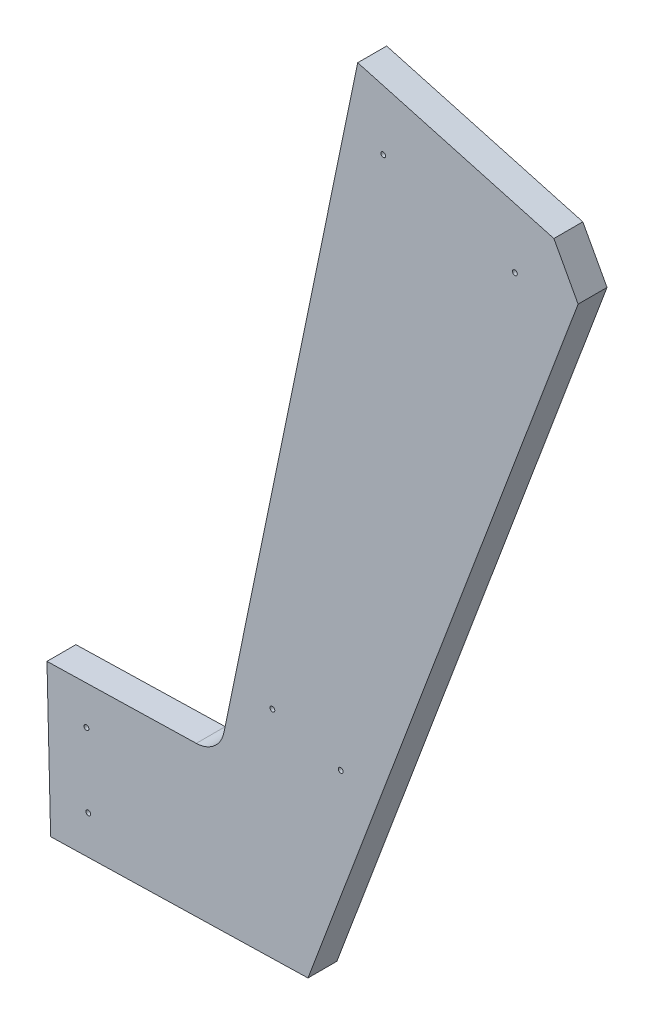
ISO-10303-21;
HEADER;
FILE_DESCRIPTION(('STEP AP214'),'2;1');
FILE_NAME('part.step','',(''),(''),'','','');
FILE_SCHEMA(('AUTOMOTIVE_DESIGN { 1 0 10303 214 1 1 1 1 }'));
ENDSEC;
DATA;
#1=APPLICATION_CONTEXT('core data for automotive mechanical design processes');
#2=APPLICATION_PROTOCOL_DEFINITION('international standard','automotive_design',2000,#1);
#3=PRODUCT_CONTEXT('',#1,'mechanical');
#4=PRODUCT('Part','Part','',(#3));
#5=PRODUCT_RELATED_PRODUCT_CATEGORY('part','',(#4));
#6=PRODUCT_DEFINITION_FORMATION('','',#4);
#7=PRODUCT_DEFINITION_CONTEXT('part definition',#1,'design');
#8=PRODUCT_DEFINITION('design','',#6,#7);
#9=PRODUCT_DEFINITION_SHAPE('','',#8);
#10=(LENGTH_UNIT() NAMED_UNIT(*) SI_UNIT(.MILLI.,.METRE.));
#11=(NAMED_UNIT(*) PLANE_ANGLE_UNIT() SI_UNIT($,.RADIAN.));
#12=(NAMED_UNIT(*) SI_UNIT($,.STERADIAN.) SOLID_ANGLE_UNIT());
#13=UNCERTAINTY_MEASURE_WITH_UNIT(LENGTH_MEASURE(1.E-05),#10,'distance_accuracy_value','');
#14=(GEOMETRIC_REPRESENTATION_CONTEXT(3) GLOBAL_UNCERTAINTY_ASSIGNED_CONTEXT((#13)) GLOBAL_UNIT_ASSIGNED_CONTEXT((#10,
#11,#12)) REPRESENTATION_CONTEXT('',''));
#15=CARTESIAN_POINT('',(0.,0.,0.));
#16=DIRECTION('',(0.,0.,1.));
#17=DIRECTION('',(1.,0.,0.));
#18=AXIS2_PLACEMENT_3D('',#15,#16,#17);
#19=CARTESIAN_POINT('',(142.933900932431,-61.3062237529481,19.05));
#20=DIRECTION('',(0.979276102976253,-0.202529785808515,0.));
#21=DIRECTION('',(0.202529785808515,0.979276102976253,0.));
#22=AXIS2_PLACEMENT_3D('',#19,#20,#21);
#23=PLANE('',#22);
#24=DIRECTION('',(-0.202529785808515,-0.979276102976253,0.));
#25=VECTOR('',#24,1.);
#26=CARTESIAN_POINT('',(142.933900932431,-61.3062237529481,0.));
#27=LINE('',#26,#25);
#28=CARTESIAN_POINT('',(142.933900932431,-61.3062237529481,0.));
#29=VERTEX_POINT('',#28);
#30=CARTESIAN_POINT('',(54.780700043986,-487.546357698174,0.));
#31=VERTEX_POINT('',#30);
#32=EDGE_CURVE('E131',#29,#31,#27,.T.);
#33=ORIENTED_EDGE('',*,*,#32,.T.);
#34=DIRECTION('',(0.,0.,-1.));
#35=VECTOR('',#34,1.);
#36=CARTESIAN_POINT('',(54.780700043986,-487.546357698174,19.05));
#37=LINE('',#36,#35);
#38=CARTESIAN_POINT('',(54.780700043986,-487.546357698174,19.05));
#39=VERTEX_POINT('',#38);
#40=EDGE_CURVE('E11',#39,#31,#37,.T.);
#41=ORIENTED_EDGE('',*,*,#40,.F.);
#42=DIRECTION('',(-0.202529785808515,-0.979276102976253,0.));
#43=VECTOR('',#42,1.);
#44=CARTESIAN_POINT('',(142.933900932431,-61.3062237529481,19.05));
#45=LINE('',#44,#43);
#46=CARTESIAN_POINT('',(142.933900932431,-61.3062237529481,19.05));
#47=VERTEX_POINT('',#46);
#48=EDGE_CURVE('E146',#47,#39,#45,.T.);
#49=ORIENTED_EDGE('',*,*,#48,.F.);
#50=DIRECTION('',(0.,0.,-1.));
#51=VECTOR('',#50,1.);
#52=CARTESIAN_POINT('',(142.933900932431,-61.3062237529481,19.05));
#53=LINE('',#52,#51);
#54=EDGE_CURVE('E127',#47,#29,#53,.T.);
#55=ORIENTED_EDGE('',*,*,#54,.T.);
#56=EDGE_LOOP('',(#33,#41,#49,#55));
#57=FACE_BOUND('',#56,.T.);
#58=ADVANCED_FACE('F33',(#57),#23,.F.);
#59=CARTESIAN_POINT('',(36.1254902822884,-483.688165278521,19.05));
#60=DIRECTION('',(0.,0.,-1.));
#61=DIRECTION('',(-1.,0.,0.));
#62=AXIS2_PLACEMENT_3D('',#59,#60,#61);
#63=CYLINDRICAL_SURFACE('',#62,19.05);
#64=CARTESIAN_POINT('',(36.1254902822884,-483.688165278521,0.));
#65=DIRECTION('',(0.,0.,-1.));
#66=DIRECTION('',(-1.,0.,0.));
#67=AXIS2_PLACEMENT_3D('',#64,#65,#66);
#68=CIRCLE('',#67,19.05);
#69=CARTESIAN_POINT('',(36.5904963039966,-502.732489089037,0.));
#70=VERTEX_POINT('',#69);
#71=EDGE_CURVE('E134',#31,#70,#68,.T.);
#72=ORIENTED_EDGE('',*,*,#71,.T.);
#73=DIRECTION('',(0.,0.,-1.));
#74=VECTOR('',#73,1.);
#75=CARTESIAN_POINT('',(36.5904963039966,-502.732489089037,19.05));
#76=LINE('',#75,#74);
#77=CARTESIAN_POINT('',(36.5904963039966,-502.732489089037,19.05));
#78=VERTEX_POINT('',#77);
#79=EDGE_CURVE('E42',#78,#70,#76,.T.);
#80=ORIENTED_EDGE('',*,*,#79,.F.);
#81=CARTESIAN_POINT('',(36.1254902822884,-483.688165278521,19.05));
#82=DIRECTION('',(0.,0.,-1.));
#83=DIRECTION('',(-1.,0.,0.));
#84=AXIS2_PLACEMENT_3D('',#81,#82,#83);
#85=CIRCLE('',#84,19.05);
#86=EDGE_CURVE('E94',#39,#78,#85,.T.);
#87=ORIENTED_EDGE('',*,*,#86,.F.);
#88=ORIENTED_EDGE('',*,*,#40,.T.);
#89=EDGE_LOOP('',(#72,#80,#87,#88));
#90=FACE_BOUND('',#89,.T.);
#91=ADVANCED_FACE('F223',(#90),#63,.F.);
#92=CARTESIAN_POINT('',(36.5904963039966,-502.732489089037,19.05));
#93=DIRECTION('',(0.0244097649190735,-0.999702037297412,0.));
#94=DIRECTION('',(0.999702037297412,0.0244097649190735,0.));
#95=AXIS2_PLACEMENT_3D('',#92,#93,#94);
#96=PLANE('',#95);
#97=DIRECTION('',(-0.999702037297412,-0.0244097649190735,0.));
#98=VECTOR('',#97,1.);
#99=CARTESIAN_POINT('',(36.5904963039966,-502.732489089037,0.));
#100=LINE('',#99,#98);
#101=CARTESIAN_POINT('',(-61.753066591888,-505.133747826173,0.));
#102=VERTEX_POINT('',#101);
#103=EDGE_CURVE('E137',#70,#102,#100,.T.);
#104=ORIENTED_EDGE('',*,*,#103,.T.);
#105=DIRECTION('',(0.,0.,-1.));
#106=VECTOR('',#105,1.);
#107=CARTESIAN_POINT('',(-61.753066591888,-505.133747826173,19.05));
#108=LINE('',#107,#106);
#109=CARTESIAN_POINT('',(-61.753066591888,-505.133747826173,19.05));
#110=VERTEX_POINT('',#109);
#111=EDGE_CURVE('E153',#110,#102,#108,.T.);
#112=ORIENTED_EDGE('',*,*,#111,.F.);
#113=DIRECTION('',(-0.999702037297412,-0.0244097649190735,0.));
#114=VECTOR('',#113,1.);
#115=CARTESIAN_POINT('',(36.5904963039966,-502.732489089037,19.05));
#116=LINE('',#115,#114);
#117=EDGE_CURVE('E191',#78,#110,#116,.T.);
#118=ORIENTED_EDGE('',*,*,#117,.F.);
#119=ORIENTED_EDGE('',*,*,#79,.T.);
#120=EDGE_LOOP('',(#104,#112,#118,#119));
#121=FACE_BOUND('',#120,.T.);
#122=ADVANCED_FACE('F227',(#121),#96,.F.);
#123=CARTESIAN_POINT('',(-61.753066591888,-505.133747826173,19.05));
#124=DIRECTION('',(0.999702037297413,0.0244097649190363,0.));
#125=DIRECTION('',(-0.0244097649190363,0.999702037297413,0.));
#126=AXIS2_PLACEMENT_3D('',#123,#124,#125);
#127=PLANE('',#126);
#128=DIRECTION('',(0.0244097649190363,-0.999702037297413,0.));
#129=VECTOR('',#128,1.);
#130=CARTESIAN_POINT('',(-61.753066591888,-505.133747826173,0.));
#131=LINE('',#130,#129);
#132=CARTESIAN_POINT('',(-59.3403163112281,-603.947946941402,0.));
#133=VERTEX_POINT('',#132);
#134=EDGE_CURVE('E139',#102,#133,#131,.T.);
#135=ORIENTED_EDGE('',*,*,#134,.T.);
#136=DIRECTION('',(0.,0.,-1.));
#137=VECTOR('',#136,1.);
#138=CARTESIAN_POINT('',(-59.3403163112281,-603.947946941402,19.05));
#139=LINE('',#138,#137);
#140=CARTESIAN_POINT('',(-59.3403163112281,-603.947946941402,19.05));
#141=VERTEX_POINT('',#140);
#142=EDGE_CURVE('E150',#141,#133,#139,.T.);
#143=ORIENTED_EDGE('',*,*,#142,.F.);
#144=DIRECTION('',(0.0244097649190363,-0.999702037297413,0.));
#145=VECTOR('',#144,1.);
#146=CARTESIAN_POINT('',(-61.753066591888,-505.133747826173,19.05));
#147=LINE('',#146,#145);
#148=EDGE_CURVE('E193',#110,#141,#147,.T.);
#149=ORIENTED_EDGE('',*,*,#148,.F.);
#150=ORIENTED_EDGE('',*,*,#111,.T.);
#151=EDGE_LOOP('',(#135,#143,#149,#150));
#152=FACE_BOUND('',#151,.T.);
#153=ADVANCED_FACE('F199',(#152),#127,.F.);
#154=CARTESIAN_POINT('',(-59.3403163112281,-603.947946941402,19.05));
#155=DIRECTION('',(-0.0244097649190362,0.999702037297413,0.));
#156=DIRECTION('',(-0.999702037297413,-0.0244097649190362,0.));
#157=AXIS2_PLACEMENT_3D('',#154,#155,#156);
#158=PLANE('',#157);
#159=DIRECTION('',(0.999702037297413,0.0244097649190362,0.));
#160=VECTOR('',#159,1.);
#161=CARTESIAN_POINT('',(-59.3403163112281,-603.947946941402,0.));
#162=LINE('',#161,#160);
#163=CARTESIAN_POINT('',(110.157739028049,-599.809306095725,0.));
#164=VERTEX_POINT('',#163);
#165=EDGE_CURVE('E141',#133,#164,#162,.T.);
#166=ORIENTED_EDGE('',*,*,#165,.T.);
#167=DIRECTION('',(0.,0.,-1.));
#168=VECTOR('',#167,1.);
#169=CARTESIAN_POINT('',(110.157739028049,-599.809306095725,19.05));
#170=LINE('',#169,#168);
#171=CARTESIAN_POINT('',(110.157739028049,-599.809306095725,19.05));
#172=VERTEX_POINT('',#171);
#173=EDGE_CURVE('E122',#172,#164,#170,.T.);
#174=ORIENTED_EDGE('',*,*,#173,.F.);
#175=DIRECTION('',(0.999702037297413,0.0244097649190362,0.));
#176=VECTOR('',#175,1.);
#177=CARTESIAN_POINT('',(-59.3403163112281,-603.947946941402,19.05));
#178=LINE('',#177,#176);
#179=EDGE_CURVE('E113',#141,#172,#178,.T.);
#180=ORIENTED_EDGE('',*,*,#179,.F.);
#181=ORIENTED_EDGE('',*,*,#142,.T.);
#182=EDGE_LOOP('',(#166,#174,#180,#181));
#183=FACE_BOUND('',#182,.T.);
#184=ADVANCED_FACE('F203',(#183),#158,.F.);
#185=CARTESIAN_POINT('',(110.157739028049,-599.809306095725,19.05));
#186=DIRECTION('',(-0.936051647242134,0.35186263469611,0.));
#187=DIRECTION('',(-0.35186263469611,-0.936051647242134,0.));
#188=AXIS2_PLACEMENT_3D('',#185,#186,#187);
#189=PLANE('',#188);
#190=DIRECTION('',(0.35186263469611,0.936051647242134,0.));
#191=VECTOR('',#190,1.);
#192=CARTESIAN_POINT('',(110.157739028049,-599.809306095725,0.));
#193=LINE('',#192,#191);
#194=CARTESIAN_POINT('',(288.094390134916,-126.44874163232,0.));
#195=VERTEX_POINT('',#194);
#196=EDGE_CURVE('E121',#164,#195,#193,.T.);
#197=ORIENTED_EDGE('',*,*,#196,.T.);
#198=DIRECTION('',(0.,0.,-1.));
#199=VECTOR('',#198,1.);
#200=CARTESIAN_POINT('',(288.094390134916,-126.44874163232,19.05));
#201=LINE('',#200,#199);
#202=CARTESIAN_POINT('',(288.094390134916,-126.44874163232,19.05));
#203=VERTEX_POINT('',#202);
#204=EDGE_CURVE('E118',#203,#195,#201,.T.);
#205=ORIENTED_EDGE('',*,*,#204,.F.);
#206=DIRECTION('',(0.35186263469611,0.936051647242134,0.));
#207=VECTOR('',#206,1.);
#208=CARTESIAN_POINT('',(110.157739028049,-599.809306095725,19.05));
#209=LINE('',#208,#207);
#210=EDGE_CURVE('E107',#172,#203,#209,.T.);
#211=ORIENTED_EDGE('',*,*,#210,.F.);
#212=ORIENTED_EDGE('',*,*,#173,.T.);
#213=EDGE_LOOP('',(#197,#205,#211,#212));
#214=FACE_BOUND('',#213,.T.);
#215=ADVANCED_FACE('F119',(#214),#189,.F.);
#216=CARTESIAN_POINT('',(288.094390134916,-126.44874163232,19.05));
#217=DIRECTION('',(-0.879321769674926,-0.476228123251615,0.));
#218=DIRECTION('',(0.476228123251615,-0.879321769674926,0.));
#219=AXIS2_PLACEMENT_3D('',#216,#217,#218);
#220=PLANE('',#219);
#221=DIRECTION('',(-0.476228123251615,0.879321769674926,0.));
#222=VECTOR('',#221,1.);
#223=CARTESIAN_POINT('',(288.094390134916,-126.44874163232,0.));
#224=LINE('',#223,#222);
#225=CARTESIAN_POINT('',(272.141590142151,-96.9930172934674,0.));
#226=VERTEX_POINT('',#225);
#227=EDGE_CURVE('E80',#195,#226,#224,.T.);
#228=ORIENTED_EDGE('',*,*,#227,.T.);
#229=DIRECTION('',(0.,0.,-1.));
#230=VECTOR('',#229,1.);
#231=CARTESIAN_POINT('',(272.141590142151,-96.9930172934674,19.05));
#232=LINE('',#231,#230);
#233=CARTESIAN_POINT('',(272.141590142151,-96.9930172934674,19.05));
#234=VERTEX_POINT('',#233);
#235=EDGE_CURVE('E123',#234,#226,#232,.T.);
#236=ORIENTED_EDGE('',*,*,#235,.F.);
#237=DIRECTION('',(-0.476228123251615,0.879321769674926,0.));
#238=VECTOR('',#237,1.);
#239=CARTESIAN_POINT('',(288.094390134916,-126.44874163232,19.05));
#240=LINE('',#239,#238);
#241=EDGE_CURVE('E111',#203,#234,#240,.T.);
#242=ORIENTED_EDGE('',*,*,#241,.F.);
#243=ORIENTED_EDGE('',*,*,#204,.T.);
#244=EDGE_LOOP('',(#228,#236,#242,#243));
#245=FACE_BOUND('',#244,.T.);
#246=ADVANCED_FACE('F125',(#245),#220,.F.);
#247=CARTESIAN_POINT('',(272.141590142151,-96.9930172934674,19.05));
#248=DIRECTION('',(-0.266229118281915,-0.963909776161044,0.));
#249=DIRECTION('',(0.963909776161044,-0.266229118281915,0.));
#250=AXIS2_PLACEMENT_3D('',#247,#248,#249);
#251=PLANE('',#250);
#252=DIRECTION('',(-0.963909776161044,0.266229118281915,0.));
#253=VECTOR('',#252,1.);
#254=CARTESIAN_POINT('',(272.141590142151,-96.9930172934674,0.));
#255=LINE('',#254,#253);
#256=EDGE_CURVE('E86',#226,#29,#255,.T.);
#257=ORIENTED_EDGE('',*,*,#256,.T.);
#258=ORIENTED_EDGE('',*,*,#54,.F.);
#259=DIRECTION('',(-0.963909776161044,0.266229118281915,0.));
#260=VECTOR('',#259,1.);
#261=CARTESIAN_POINT('',(272.141590142151,-96.9930172934674,19.05));
#262=LINE('',#261,#260);
#263=EDGE_CURVE('E51',#234,#47,#262,.T.);
#264=ORIENTED_EDGE('',*,*,#263,.F.);
#265=ORIENTED_EDGE('',*,*,#235,.T.);
#266=EDGE_LOOP('',(#257,#258,#264,#265));
#267=FACE_BOUND('',#266,.T.);
#268=ADVANCED_FACE('F211',(#267),#251,.F.);
#269=CARTESIAN_POINT('',(36.1254902822884,-483.688165278521,19.05));
#270=DIRECTION('',(0.,0.,-1.));
#271=DIRECTION('',(-1.,0.,0.));
#272=AXIS2_PLACEMENT_3D('',#269,#270,#271);
#273=PLANE('',#272);
#274=CARTESIAN_POINT('',(159.700824407552,-105.378862880679,19.0500000000003));
#275=DIRECTION('',(0.,0.,-1.));
#276=DIRECTION('',(0.,1.,0.));
#277=AXIS2_PLACEMENT_3D('',#274,#275,#276);
#278=CIRCLE('',#277,1.58749999999999);
#279=CARTESIAN_POINT('',(159.700824407552,-103.791362880679,19.0500000000003));
#280=VERTEX_POINT('',#279);
#281=EDGE_CURVE('E333',#280,#280,#278,.T.);
#282=ORIENTED_EDGE('',*,*,#281,.T.);
#283=EDGE_LOOP('',(#282));
#284=FACE_BOUND('',#283,.T.);
#285=CARTESIAN_POINT('',(246.468290617973,-129.343788432899,19.0500000000003));
#286=DIRECTION('',(0.,0.,-1.));
#287=DIRECTION('',(0.,1.,0.));
#288=AXIS2_PLACEMENT_3D('',#285,#286,#287);
#289=CIRCLE('',#288,1.58749999999999);
#290=CARTESIAN_POINT('',(246.468290617973,-127.756288432899,19.0500000000003));
#291=VERTEX_POINT('',#290);
#292=EDGE_CURVE('E181',#291,#291,#289,.T.);
#293=ORIENTED_EDGE('',*,*,#292,.T.);
#294=EDGE_LOOP('',(#293));
#295=FACE_BOUND('',#294,.T.);
#296=CARTESIAN_POINT('',(86.7437729199121,-458.142268916191,19.0500000000033));
#297=DIRECTION('',(0.,0.,-1.));
#298=DIRECTION('',(0.,1.,0.));
#299=AXIS2_PLACEMENT_3D('',#296,#297,#298);
#300=CIRCLE('',#299,1.58750000000001);
#301=CARTESIAN_POINT('',(86.7437729199121,-456.554768916191,19.0500000000033));
#302=VERTEX_POINT('',#301);
#303=EDGE_CURVE('E170',#302,#302,#300,.T.);
#304=ORIENTED_EDGE('',*,*,#303,.T.);
#305=EDGE_LOOP('',(#304));
#306=FACE_BOUND('',#305,.T.);
#307=CARTESIAN_POINT('',(131.716117614273,-470.563501661371,19.0500000000033));
#308=DIRECTION('',(0.,0.,-1.));
#309=DIRECTION('',(0.,1.,0.));
#310=AXIS2_PLACEMENT_3D('',#307,#308,#309);
#311=CIRCLE('',#310,1.58749999999999);
#312=CARTESIAN_POINT('',(131.716117614273,-468.976001661371,19.0500000000033));
#313=VERTEX_POINT('',#312);
#314=EDGE_CURVE('E167',#313,#313,#311,.T.);
#315=ORIENTED_EDGE('',*,*,#314,.T.);
#316=EDGE_LOOP('',(#315));
#317=FACE_BOUND('',#316,.T.);
#318=CARTESIAN_POINT('',(-35.7406268155492,-529.906171544556,19.0500000000042));
#319=DIRECTION('',(0.,0.,-1.));
#320=DIRECTION('',(0.,1.,0.));
#321=AXIS2_PLACEMENT_3D('',#318,#319,#320);
#322=CIRCLE('',#321,1.5875);
#323=CARTESIAN_POINT('',(-35.7406268155492,-528.318671544556,19.0500000000042));
#324=VERTEX_POINT('',#323);
#325=EDGE_CURVE('E164',#324,#324,#322,.T.);
#326=ORIENTED_EDGE('',*,*,#325,.T.);
#327=EDGE_LOOP('',(#326));
#328=FACE_BOUND('',#327,.T.);
#329=CARTESIAN_POINT('',(-34.5678925927641,-577.935507165077,19.0500000000046));
#330=DIRECTION('',(0.,0.,-1.));
#331=DIRECTION('',(0.,1.,0.));
#332=AXIS2_PLACEMENT_3D('',#329,#330,#331);
#333=CIRCLE('',#332,1.5875);
#334=CARTESIAN_POINT('',(-34.5678925927641,-576.348007165077,19.0500000000046));
#335=VERTEX_POINT('',#334);
#336=EDGE_CURVE('E160',#335,#335,#333,.T.);
#337=ORIENTED_EDGE('',*,*,#336,.T.);
#338=EDGE_LOOP('',(#337));
#339=FACE_BOUND('',#338,.T.);
#340=ORIENTED_EDGE('',*,*,#48,.T.);
#341=ORIENTED_EDGE('',*,*,#86,.T.);
#342=ORIENTED_EDGE('',*,*,#117,.T.);
#343=ORIENTED_EDGE('',*,*,#148,.T.);
#344=ORIENTED_EDGE('',*,*,#179,.T.);
#345=ORIENTED_EDGE('',*,*,#210,.T.);
#346=ORIENTED_EDGE('',*,*,#241,.T.);
#347=ORIENTED_EDGE('',*,*,#263,.T.);
#348=EDGE_LOOP('',(#340,#341,#342,#343,#344,#345,#346,#347));
#349=FACE_BOUND('',#348,.T.);
#350=ADVANCED_FACE('F109',(#284,#295,#306,#317,#328,#339,#349),#273,.F.);
#351=CARTESIAN_POINT('',(36.1254902822884,-483.688165278521,0.));
#352=DIRECTION('',(0.,0.,-1.));
#353=DIRECTION('',(-1.,0.,0.));
#354=AXIS2_PLACEMENT_3D('',#351,#352,#353);
#355=PLANE('',#354);
#356=CARTESIAN_POINT('',(159.700824407552,-105.37886288068,0.));
#357=DIRECTION('',(0.,0.,-1.));
#358=DIRECTION('',(-1.,0.,0.));
#359=AXIS2_PLACEMENT_3D('',#356,#357,#358);
#360=CIRCLE('',#359,1.58749999999999);
#361=CARTESIAN_POINT('',(158.113324407552,-105.37886288068,0.));
#362=VERTEX_POINT('',#361);
#363=EDGE_CURVE('E36',#362,#362,#360,.T.);
#364=ORIENTED_EDGE('',*,*,#363,.F.);
#365=EDGE_LOOP('',(#364));
#366=FACE_BOUND('',#365,.T.);
#367=CARTESIAN_POINT('',(246.468290617973,-129.343788432899,0.));
#368=DIRECTION('',(0.,0.,-1.));
#369=DIRECTION('',(-1.,0.,0.));
#370=AXIS2_PLACEMENT_3D('',#367,#368,#369);
#371=CIRCLE('',#370,1.58749999999999);
#372=CARTESIAN_POINT('',(244.880790617973,-129.343788432899,0.));
#373=VERTEX_POINT('',#372);
#374=EDGE_CURVE('E176',#373,#373,#371,.T.);
#375=ORIENTED_EDGE('',*,*,#374,.F.);
#376=EDGE_LOOP('',(#375));
#377=FACE_BOUND('',#376,.T.);
#378=CARTESIAN_POINT('',(86.7437729199121,-458.142268916191,0.));
#379=DIRECTION('',(0.,0.,-1.));
#380=DIRECTION('',(-1.,0.,0.));
#381=AXIS2_PLACEMENT_3D('',#378,#379,#380);
#382=CIRCLE('',#381,1.58750000000001);
#383=CARTESIAN_POINT('',(85.1562729199121,-458.142268916191,0.));
#384=VERTEX_POINT('',#383);
#385=EDGE_CURVE('E168',#384,#384,#382,.T.);
#386=ORIENTED_EDGE('',*,*,#385,.F.);
#387=EDGE_LOOP('',(#386));
#388=FACE_BOUND('',#387,.T.);
#389=CARTESIAN_POINT('',(131.716117614273,-470.563501661371,0.));
#390=DIRECTION('',(0.,0.,-1.));
#391=DIRECTION('',(-1.,0.,0.));
#392=AXIS2_PLACEMENT_3D('',#389,#390,#391);
#393=CIRCLE('',#392,1.58749999999999);
#394=CARTESIAN_POINT('',(130.128617614273,-470.563501661371,0.));
#395=VERTEX_POINT('',#394);
#396=EDGE_CURVE('E165',#395,#395,#393,.T.);
#397=ORIENTED_EDGE('',*,*,#396,.F.);
#398=EDGE_LOOP('',(#397));
#399=FACE_BOUND('',#398,.T.);
#400=CARTESIAN_POINT('',(-35.7406268155492,-529.906171544556,0.));
#401=DIRECTION('',(0.,0.,-1.));
#402=DIRECTION('',(-1.,0.,0.));
#403=AXIS2_PLACEMENT_3D('',#400,#401,#402);
#404=CIRCLE('',#403,1.5875);
#405=CARTESIAN_POINT('',(-37.3281268155492,-529.906171544556,0.));
#406=VERTEX_POINT('',#405);
#407=EDGE_CURVE('E161',#406,#406,#404,.T.);
#408=ORIENTED_EDGE('',*,*,#407,.F.);
#409=EDGE_LOOP('',(#408));
#410=FACE_BOUND('',#409,.T.);
#411=CARTESIAN_POINT('',(-34.5678925927641,-577.935507165077,0.));
#412=DIRECTION('',(0.,0.,-1.));
#413=DIRECTION('',(-1.,0.,0.));
#414=AXIS2_PLACEMENT_3D('',#411,#412,#413);
#415=CIRCLE('',#414,1.5875);
#416=CARTESIAN_POINT('',(-36.1553925927641,-577.935507165077,0.));
#417=VERTEX_POINT('',#416);
#418=EDGE_CURVE('E135',#417,#417,#415,.T.);
#419=ORIENTED_EDGE('',*,*,#418,.F.);
#420=EDGE_LOOP('',(#419));
#421=FACE_BOUND('',#420,.T.);
#422=ORIENTED_EDGE('',*,*,#32,.F.);
#423=ORIENTED_EDGE('',*,*,#256,.F.);
#424=ORIENTED_EDGE('',*,*,#227,.F.);
#425=ORIENTED_EDGE('',*,*,#196,.F.);
#426=ORIENTED_EDGE('',*,*,#165,.F.);
#427=ORIENTED_EDGE('',*,*,#134,.F.);
#428=ORIENTED_EDGE('',*,*,#103,.F.);
#429=ORIENTED_EDGE('',*,*,#71,.F.);
#430=EDGE_LOOP('',(#422,#423,#424,#425,#426,#427,#428,#429));
#431=FACE_BOUND('',#430,.T.);
#432=ADVANCED_FACE('F206',(#366,#377,#388,#399,#410,#421,#431),#355,.T.);
#433=CARTESIAN_POINT('',(-34.5678925927641,-577.935507165077,-19.0499999999954));
#434=DIRECTION('',(0.,0.,-1.));
#435=DIRECTION('',(0.,1.,0.));
#436=AXIS2_PLACEMENT_3D('',#433,#434,#435);
#437=CYLINDRICAL_SURFACE('',#436,1.5875);
#438=ORIENTED_EDGE('',*,*,#418,.T.);
#439=EDGE_LOOP('',(#438));
#440=FACE_BOUND('',#439,.T.);
#441=ORIENTED_EDGE('',*,*,#336,.F.);
#442=EDGE_LOOP('',(#441));
#443=FACE_BOUND('',#442,.T.);
#444=ADVANCED_FACE('F266',(#440,#443),#437,.F.);
#445=CARTESIAN_POINT('',(-35.7406268155492,-529.906171544556,-19.0499999999958));
#446=DIRECTION('',(0.,0.,-1.));
#447=DIRECTION('',(0.,1.,0.));
#448=AXIS2_PLACEMENT_3D('',#445,#446,#447);
#449=CYLINDRICAL_SURFACE('',#448,1.5875);
#450=ORIENTED_EDGE('',*,*,#407,.T.);
#451=EDGE_LOOP('',(#450));
#452=FACE_BOUND('',#451,.T.);
#453=ORIENTED_EDGE('',*,*,#325,.F.);
#454=EDGE_LOOP('',(#453));
#455=FACE_BOUND('',#454,.T.);
#456=ADVANCED_FACE('F275',(#452,#455),#449,.F.);
#457=CARTESIAN_POINT('',(131.716117614273,-470.563501661371,-19.0499999999967));
#458=DIRECTION('',(0.,0.,-1.));
#459=DIRECTION('',(0.,1.,0.));
#460=AXIS2_PLACEMENT_3D('',#457,#458,#459);
#461=CYLINDRICAL_SURFACE('',#460,1.58749999999999);
#462=ORIENTED_EDGE('',*,*,#396,.T.);
#463=EDGE_LOOP('',(#462));
#464=FACE_BOUND('',#463,.T.);
#465=ORIENTED_EDGE('',*,*,#314,.F.);
#466=EDGE_LOOP('',(#465));
#467=FACE_BOUND('',#466,.T.);
#468=ADVANCED_FACE('F285',(#464,#467),#461,.F.);
#469=CARTESIAN_POINT('',(86.7437729199121,-458.142268916191,-19.0499999999967));
#470=DIRECTION('',(0.,0.,-1.));
#471=DIRECTION('',(0.,1.,0.));
#472=AXIS2_PLACEMENT_3D('',#469,#470,#471);
#473=CYLINDRICAL_SURFACE('',#472,1.58750000000001);
#474=ORIENTED_EDGE('',*,*,#385,.T.);
#475=EDGE_LOOP('',(#474));
#476=FACE_BOUND('',#475,.T.);
#477=ORIENTED_EDGE('',*,*,#303,.F.);
#478=EDGE_LOOP('',(#477));
#479=FACE_BOUND('',#478,.T.);
#480=ADVANCED_FACE('F295',(#476,#479),#473,.F.);
#481=CARTESIAN_POINT('',(246.468290617973,-129.343788432899,-19.0499999999997));
#482=DIRECTION('',(0.,0.,-1.));
#483=DIRECTION('',(0.,1.,0.));
#484=AXIS2_PLACEMENT_3D('',#481,#482,#483);
#485=CYLINDRICAL_SURFACE('',#484,1.58749999999999);
#486=ORIENTED_EDGE('',*,*,#374,.T.);
#487=EDGE_LOOP('',(#486));
#488=FACE_BOUND('',#487,.T.);
#489=ORIENTED_EDGE('',*,*,#292,.F.);
#490=EDGE_LOOP('',(#489));
#491=FACE_BOUND('',#490,.T.);
#492=ADVANCED_FACE('F305',(#488,#491),#485,.F.);
#493=CARTESIAN_POINT('',(159.700824407552,-105.37886288068,-19.0499999999997));
#494=DIRECTION('',(0.,0.,-1.));
#495=DIRECTION('',(0.,1.,0.));
#496=AXIS2_PLACEMENT_3D('',#493,#494,#495);
#497=CYLINDRICAL_SURFACE('',#496,1.58749999999999);
#498=ORIENTED_EDGE('',*,*,#363,.T.);
#499=EDGE_LOOP('',(#498));
#500=FACE_BOUND('',#499,.T.);
#501=ORIENTED_EDGE('',*,*,#281,.F.);
#502=EDGE_LOOP('',(#501));
#503=FACE_BOUND('',#502,.T.);
#504=ADVANCED_FACE('F314',(#500,#503),#497,.F.);
#505=CLOSED_SHELL('',(#58,#91,#122,#153,#184,#215,#246,#268,#350,#432,#444,#456,#468,#480,#492,#504));
#506=MANIFOLD_SOLID_BREP('B2',#505);
#507=ADVANCED_BREP_SHAPE_REPRESENTATION('',(#18,#506),#14);
#508=SHAPE_DEFINITION_REPRESENTATION(#9,#507);
ENDSEC;
END-ISO-10303-21;
